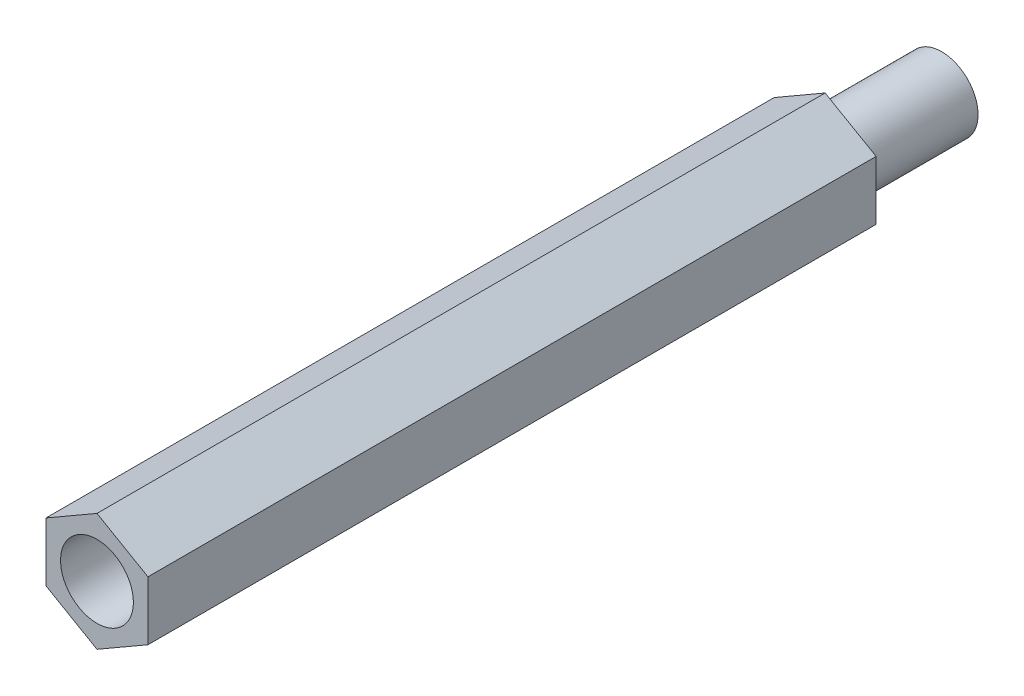
ISO-10303-21;
HEADER;
FILE_DESCRIPTION(('STEP AP214'),'2;1');
FILE_NAME('part.step','',(''),(''),'','','');
FILE_SCHEMA(('AUTOMOTIVE_DESIGN { 1 0 10303 214 1 1 1 1 }'));
ENDSEC;
DATA;
#1=APPLICATION_CONTEXT('core data for automotive mechanical design processes');
#2=APPLICATION_PROTOCOL_DEFINITION('international standard','automotive_design',2000,#1);
#3=PRODUCT_CONTEXT('',#1,'mechanical');
#4=PRODUCT('Part','Part','',(#3));
#5=PRODUCT_RELATED_PRODUCT_CATEGORY('part','',(#4));
#6=PRODUCT_DEFINITION_FORMATION('','',#4);
#7=PRODUCT_DEFINITION_CONTEXT('part definition',#1,'design');
#8=PRODUCT_DEFINITION('design','',#6,#7);
#9=PRODUCT_DEFINITION_SHAPE('','',#8);
#10=(LENGTH_UNIT() NAMED_UNIT(*) SI_UNIT(.MILLI.,.METRE.));
#11=(NAMED_UNIT(*) PLANE_ANGLE_UNIT() SI_UNIT($,.RADIAN.));
#12=(NAMED_UNIT(*) SI_UNIT($,.STERADIAN.) SOLID_ANGLE_UNIT());
#13=UNCERTAINTY_MEASURE_WITH_UNIT(LENGTH_MEASURE(1.E-05),#10,'distance_accuracy_value','');
#14=(GEOMETRIC_REPRESENTATION_CONTEXT(3) GLOBAL_UNCERTAINTY_ASSIGNED_CONTEXT((#13)) GLOBAL_UNIT_ASSIGNED_CONTEXT((#10,
#11,#12)) REPRESENTATION_CONTEXT('',''));
#15=CARTESIAN_POINT('',(0.,0.,0.));
#16=DIRECTION('',(0.,0.,1.));
#17=DIRECTION('',(1.,0.,0.));
#18=AXIS2_PLACEMENT_3D('',#15,#16,#17);
#19=CARTESIAN_POINT('',(0.,-4.04145188432738,60.));
#20=DIRECTION('',(-0.500000000000001,0.866025403784438,0.));
#21=DIRECTION('',(-0.866025403784438,-0.500000000000001,0.));
#22=AXIS2_PLACEMENT_3D('',#19,#20,#21);
#23=PLANE('',#22);
#24=DIRECTION('',(0.,0.,-1.));
#25=VECTOR('',#24,1.);
#26=CARTESIAN_POINT('',(3.5,-2.02072594216369,60.));
#27=LINE('',#26,#25);
#28=CARTESIAN_POINT('',(3.49999999999998,-2.02072594216364,50.));
#29=VERTEX_POINT('',#28);
#30=CARTESIAN_POINT('',(3.5,-2.02072594216369,0.));
#31=VERTEX_POINT('',#30);
#32=EDGE_CURVE('E42',#29,#31,#27,.T.);
#33=ORIENTED_EDGE('',*,*,#32,.F.);
#34=DIRECTION('',(0.86602540378443,0.500000000000016,0.));
#35=VECTOR('',#34,1.);
#36=CARTESIAN_POINT('',(3.49999999999998,-2.02072594216364,50.));
#37=LINE('',#36,#35);
#38=CARTESIAN_POINT('',(0.,-4.04145188432738,50.));
#39=VERTEX_POINT('',#38);
#40=EDGE_CURVE('E108',#39,#29,#37,.T.);
#41=ORIENTED_EDGE('',*,*,#40,.F.);
#42=DIRECTION('',(0.,0.,-1.));
#43=VECTOR('',#42,1.);
#44=CARTESIAN_POINT('',(0.,-4.04145188432738,60.));
#45=LINE('',#44,#43);
#46=CARTESIAN_POINT('',(0.,-4.04145188432738,0.));
#47=VERTEX_POINT('',#46);
#48=EDGE_CURVE('E55',#39,#47,#45,.T.);
#49=ORIENTED_EDGE('',*,*,#48,.T.);
#50=DIRECTION('',(0.866025403784438,0.500000000000001,0.));
#51=VECTOR('',#50,1.);
#52=CARTESIAN_POINT('',(0.,-4.04145188432738,0.));
#53=LINE('',#52,#51);
#54=EDGE_CURVE('E140',#47,#31,#53,.T.);
#55=ORIENTED_EDGE('',*,*,#54,.T.);
#56=EDGE_LOOP('',(#33,#41,#49,#55));
#57=FACE_BOUND('',#56,.T.);
#58=ADVANCED_FACE('F39',(#57),#23,.F.);
#59=CARTESIAN_POINT('',(3.5,-2.02072594216369,60.));
#60=DIRECTION('',(-1.,0.,0.));
#61=DIRECTION('',(0.,-1.,0.));
#62=AXIS2_PLACEMENT_3D('',#59,#60,#61);
#63=PLANE('',#62);
#64=DIRECTION('',(0.,0.,-1.));
#65=VECTOR('',#64,1.);
#66=CARTESIAN_POINT('',(3.5,2.02072594216369,60.));
#67=LINE('',#66,#65);
#68=CARTESIAN_POINT('',(3.49999999999998,2.02072594216373,50.));
#69=VERTEX_POINT('',#68);
#70=CARTESIAN_POINT('',(3.5,2.02072594216369,0.));
#71=VERTEX_POINT('',#70);
#72=EDGE_CURVE('E167',#69,#71,#67,.T.);
#73=ORIENTED_EDGE('',*,*,#72,.F.);
#74=DIRECTION('',(0.,1.,0.));
#75=VECTOR('',#74,1.);
#76=CARTESIAN_POINT('',(3.49999999999998,2.02072594216373,50.));
#77=LINE('',#76,#75);
#78=EDGE_CURVE('E124',#29,#69,#77,.T.);
#79=ORIENTED_EDGE('',*,*,#78,.F.);
#80=ORIENTED_EDGE('',*,*,#32,.T.);
#81=DIRECTION('',(0.,1.,0.));
#82=VECTOR('',#81,1.);
#83=CARTESIAN_POINT('',(3.5,-2.02072594216369,0.));
#84=LINE('',#83,#82);
#85=EDGE_CURVE('E144',#31,#71,#84,.T.);
#86=ORIENTED_EDGE('',*,*,#85,.T.);
#87=EDGE_LOOP('',(#73,#79,#80,#86));
#88=FACE_BOUND('',#87,.T.);
#89=ADVANCED_FACE('F175',(#88),#63,.F.);
#90=CARTESIAN_POINT('',(3.5,2.02072594216369,60.));
#91=DIRECTION('',(-0.5,-0.866025403784439,0.));
#92=DIRECTION('',(0.866025403784439,-0.5,0.));
#93=AXIS2_PLACEMENT_3D('',#90,#91,#92);
#94=PLANE('',#93);
#95=DIRECTION('',(0.,0.,-1.));
#96=VECTOR('',#95,1.);
#97=CARTESIAN_POINT('',(0.,4.04145188432738,60.));
#98=LINE('',#97,#96);
#99=CARTESIAN_POINT('',(0.,4.04145188432738,50.));
#100=VERTEX_POINT('',#99);
#101=CARTESIAN_POINT('',(0.,4.04145188432738,0.));
#102=VERTEX_POINT('',#101);
#103=EDGE_CURVE('E165',#100,#102,#98,.T.);
#104=ORIENTED_EDGE('',*,*,#103,.F.);
#105=DIRECTION('',(-0.866025403784441,0.499999999999995,0.));
#106=VECTOR('',#105,1.);
#107=CARTESIAN_POINT('',(0.,4.04145188432738,50.));
#108=LINE('',#107,#106);
#109=EDGE_CURVE('E128',#69,#100,#108,.T.);
#110=ORIENTED_EDGE('',*,*,#109,.F.);
#111=ORIENTED_EDGE('',*,*,#72,.T.);
#112=DIRECTION('',(-0.866025403784438,0.5,0.));
#113=VECTOR('',#112,1.);
#114=CARTESIAN_POINT('',(3.5,2.02072594216369,0.));
#115=LINE('',#114,#113);
#116=EDGE_CURVE('E148',#71,#102,#115,.T.);
#117=ORIENTED_EDGE('',*,*,#116,.T.);
#118=EDGE_LOOP('',(#104,#110,#111,#117));
#119=FACE_BOUND('',#118,.T.);
#120=ADVANCED_FACE('F186',(#119),#94,.F.);
#121=CARTESIAN_POINT('',(0.,4.04145188432738,60.));
#122=DIRECTION('',(0.5,-0.866025403784438,0.));
#123=DIRECTION('',(0.866025403784438,0.5,0.));
#124=AXIS2_PLACEMENT_3D('',#121,#122,#123);
#125=PLANE('',#124);
#126=DIRECTION('',(0.,0.,-1.));
#127=VECTOR('',#126,1.);
#128=CARTESIAN_POINT('',(-3.5,2.02072594216369,60.));
#129=LINE('',#128,#127);
#130=CARTESIAN_POINT('',(-3.5,2.02072594216368,50.));
#131=VERTEX_POINT('',#130);
#132=CARTESIAN_POINT('',(-3.5,2.02072594216369,0.));
#133=VERTEX_POINT('',#132);
#134=EDGE_CURVE('E100',#131,#133,#129,.T.);
#135=ORIENTED_EDGE('',*,*,#134,.F.);
#136=DIRECTION('',(-0.866025403784438,-0.500000000000001,0.));
#137=VECTOR('',#136,1.);
#138=CARTESIAN_POINT('',(-3.5,2.02072594216368,50.));
#139=LINE('',#138,#137);
#140=EDGE_CURVE('E114',#100,#131,#139,.T.);
#141=ORIENTED_EDGE('',*,*,#140,.F.);
#142=ORIENTED_EDGE('',*,*,#103,.T.);
#143=DIRECTION('',(-0.866025403784439,-0.5,0.));
#144=VECTOR('',#143,1.);
#145=CARTESIAN_POINT('',(0.,4.04145188432738,0.));
#146=LINE('',#145,#144);
#147=EDGE_CURVE('E152',#102,#133,#146,.T.);
#148=ORIENTED_EDGE('',*,*,#147,.T.);
#149=EDGE_LOOP('',(#135,#141,#142,#148));
#150=FACE_BOUND('',#149,.T.);
#151=ADVANCED_FACE('F190',(#150),#125,.F.);
#152=CARTESIAN_POINT('',(-3.5,2.02072594216369,60.));
#153=DIRECTION('',(1.,0.,0.));
#154=DIRECTION('',(0.,0.,-1.));
#155=AXIS2_PLACEMENT_3D('',#152,#153,#154);
#156=PLANE('',#155);
#157=DIRECTION('',(0.,0.,-1.));
#158=VECTOR('',#157,1.);
#159=CARTESIAN_POINT('',(-3.5,-2.02072594216369,60.));
#160=LINE('',#159,#158);
#161=CARTESIAN_POINT('',(-3.49999999999999,-2.02072594216371,50.));
#162=VERTEX_POINT('',#161);
#163=CARTESIAN_POINT('',(-3.5,-2.02072594216369,0.));
#164=VERTEX_POINT('',#163);
#165=EDGE_CURVE('E62',#162,#164,#160,.T.);
#166=ORIENTED_EDGE('',*,*,#165,.F.);
#167=DIRECTION('',(0.,-1.,0.));
#168=VECTOR('',#167,1.);
#169=CARTESIAN_POINT('',(-3.49999999999999,-2.02072594216371,50.));
#170=LINE('',#169,#168);
#171=EDGE_CURVE('E95',#131,#162,#170,.T.);
#172=ORIENTED_EDGE('',*,*,#171,.F.);
#173=ORIENTED_EDGE('',*,*,#134,.T.);
#174=DIRECTION('',(0.,-1.,0.));
#175=VECTOR('',#174,1.);
#176=CARTESIAN_POINT('',(-3.5,2.02072594216369,0.));
#177=LINE('',#176,#175);
#178=EDGE_CURVE('E97',#133,#164,#177,.T.);
#179=ORIENTED_EDGE('',*,*,#178,.T.);
#180=EDGE_LOOP('',(#166,#172,#173,#179));
#181=FACE_BOUND('',#180,.T.);
#182=ADVANCED_FACE('F93',(#181),#156,.F.);
#183=CARTESIAN_POINT('',(-3.5,-2.02072594216369,60.));
#184=DIRECTION('',(0.5,0.866025403784439,0.));
#185=DIRECTION('',(-0.866025403784439,0.5,0.));
#186=AXIS2_PLACEMENT_3D('',#183,#184,#185);
#187=PLANE('',#186);
#188=ORIENTED_EDGE('',*,*,#48,.F.);
#189=DIRECTION('',(0.866025403784441,-0.499999999999995,0.));
#190=VECTOR('',#189,1.);
#191=CARTESIAN_POINT('',(0.,-4.04145188432738,50.));
#192=LINE('',#191,#190);
#193=EDGE_CURVE('E103',#162,#39,#192,.T.);
#194=ORIENTED_EDGE('',*,*,#193,.F.);
#195=ORIENTED_EDGE('',*,*,#165,.T.);
#196=DIRECTION('',(0.866025403784438,-0.5,0.));
#197=VECTOR('',#196,1.);
#198=CARTESIAN_POINT('',(-3.5,-2.02072594216369,0.));
#199=LINE('',#198,#197);
#200=EDGE_CURVE('E158',#164,#47,#199,.T.);
#201=ORIENTED_EDGE('',*,*,#200,.T.);
#202=EDGE_LOOP('',(#188,#194,#195,#201));
#203=FACE_BOUND('',#202,.T.);
#204=ADVANCED_FACE('F104',(#203),#187,.F.);
#205=CARTESIAN_POINT('',(0.,0.,0.));
#206=DIRECTION('',(0.,0.,1.));
#207=DIRECTION('',(1.,0.,0.));
#208=AXIS2_PLACEMENT_3D('',#205,#206,#207);
#209=PLANE('',#208);
#210=CARTESIAN_POINT('',(0.,0.,0.));
#211=DIRECTION('',(0.,0.,-1.));
#212=DIRECTION('',(-1.,0.,0.));
#213=AXIS2_PLACEMENT_3D('',#210,#211,#212);
#214=CIRCLE('',#213,2.5);
#215=CARTESIAN_POINT('',(-2.5,0.,0.));
#216=VERTEX_POINT('',#215);
#217=EDGE_CURVE('E11',#216,#216,#214,.T.);
#218=ORIENTED_EDGE('',*,*,#217,.F.);
#219=EDGE_LOOP('',(#218));
#220=FACE_BOUND('',#219,.T.);
#221=ORIENTED_EDGE('',*,*,#54,.F.);
#222=ORIENTED_EDGE('',*,*,#200,.F.);
#223=ORIENTED_EDGE('',*,*,#178,.F.);
#224=ORIENTED_EDGE('',*,*,#147,.F.);
#225=ORIENTED_EDGE('',*,*,#116,.F.);
#226=ORIENTED_EDGE('',*,*,#85,.F.);
#227=EDGE_LOOP('',(#221,#222,#223,#224,#225,#226));
#228=FACE_BOUND('',#227,.T.);
#229=ADVANCED_FACE('F179',(#220,#228),#209,.F.);
#230=CARTESIAN_POINT('',(0.,0.,-8.));
#231=DIRECTION('',(0.,0.,1.));
#232=DIRECTION('',(1.,0.,0.));
#233=AXIS2_PLACEMENT_3D('',#230,#231,#232);
#234=CYLINDRICAL_SURFACE('',#233,2.5);
#235=CARTESIAN_POINT('',(0.,0.,-8.));
#236=DIRECTION('',(0.,0.,-1.));
#237=DIRECTION('',(-1.,0.,0.));
#238=AXIS2_PLACEMENT_3D('',#235,#236,#237);
#239=CIRCLE('',#238,2.5);
#240=CARTESIAN_POINT('',(-2.5,0.,-8.));
#241=VERTEX_POINT('',#240);
#242=EDGE_CURVE('E137',#241,#241,#239,.T.);
#243=ORIENTED_EDGE('',*,*,#242,.F.);
#244=EDGE_LOOP('',(#243));
#245=FACE_BOUND('',#244,.T.);
#246=ORIENTED_EDGE('',*,*,#217,.T.);
#247=EDGE_LOOP('',(#246));
#248=FACE_BOUND('',#247,.T.);
#249=ADVANCED_FACE('F202',(#245,#248),#234,.T.);
#250=CARTESIAN_POINT('',(0.,0.,-8.));
#251=DIRECTION('',(0.,0.,-1.));
#252=DIRECTION('',(-1.,0.,0.));
#253=AXIS2_PLACEMENT_3D('',#250,#251,#252);
#254=PLANE('',#253);
#255=ORIENTED_EDGE('',*,*,#242,.T.);
#256=EDGE_LOOP('',(#255));
#257=FACE_BOUND('',#256,.T.);
#258=ADVANCED_FACE('F206',(#257),#254,.T.);
#259=CARTESIAN_POINT('',(0.,0.,50.));
#260=DIRECTION('',(0.,0.,-1.));
#261=DIRECTION('',(-1.,0.,0.));
#262=AXIS2_PLACEMENT_3D('',#259,#260,#261);
#263=PLANE('',#262);
#264=CARTESIAN_POINT('',(0.,0.,50.));
#265=DIRECTION('',(0.,0.,1.));
#266=DIRECTION('',(1.,0.,0.));
#267=AXIS2_PLACEMENT_3D('',#264,#265,#266);
#268=CIRCLE('',#267,2.5);
#269=CARTESIAN_POINT('',(2.5,0.,50.));
#270=VERTEX_POINT('',#269);
#271=EDGE_CURVE('E116',#270,#270,#268,.T.);
#272=ORIENTED_EDGE('',*,*,#271,.F.);
#273=EDGE_LOOP('',(#272));
#274=FACE_BOUND('',#273,.T.);
#275=ORIENTED_EDGE('',*,*,#171,.T.);
#276=ORIENTED_EDGE('',*,*,#193,.T.);
#277=ORIENTED_EDGE('',*,*,#40,.T.);
#278=ORIENTED_EDGE('',*,*,#78,.T.);
#279=ORIENTED_EDGE('',*,*,#109,.T.);
#280=ORIENTED_EDGE('',*,*,#140,.T.);
#281=EDGE_LOOP('',(#275,#276,#277,#278,#279,#280));
#282=FACE_BOUND('',#281,.T.);
#283=ADVANCED_FACE('F111',(#274,#282),#263,.F.);
#284=CARTESIAN_POINT('',(0.,0.,10.));
#285=DIRECTION('',(0.,0.,1.));
#286=DIRECTION('',(1.,0.,0.));
#287=AXIS2_PLACEMENT_3D('',#284,#285,#286);
#288=PLANE('',#287);
#289=CARTESIAN_POINT('',(0.,0.,10.));
#290=DIRECTION('',(0.,0.,1.));
#291=DIRECTION('',(1.,0.,0.));
#292=AXIS2_PLACEMENT_3D('',#289,#290,#291);
#293=CIRCLE('',#292,2.5);
#294=CARTESIAN_POINT('',(2.5,0.,10.));
#295=VERTEX_POINT('',#294);
#296=EDGE_CURVE('E133',#295,#295,#293,.T.);
#297=ORIENTED_EDGE('',*,*,#296,.T.);
#298=EDGE_LOOP('',(#297));
#299=FACE_BOUND('',#298,.T.);
#300=ADVANCED_FACE('F214',(#299),#288,.T.);
#301=CARTESIAN_POINT('',(0.,0.,10.));
#302=DIRECTION('',(0.,0.,1.));
#303=DIRECTION('',(1.,0.,0.));
#304=AXIS2_PLACEMENT_3D('',#301,#302,#303);
#305=CYLINDRICAL_SURFACE('',#304,2.5);
#306=ORIENTED_EDGE('',*,*,#296,.F.);
#307=EDGE_LOOP('',(#306));
#308=FACE_BOUND('',#307,.T.);
#309=ORIENTED_EDGE('',*,*,#271,.T.);
#310=EDGE_LOOP('',(#309));
#311=FACE_BOUND('',#310,.T.);
#312=ADVANCED_FACE('F211',(#308,#311),#305,.F.);
#313=CLOSED_SHELL('',(#58,#89,#120,#151,#182,#204,#229,#249,#258,#283,#300,#312));
#314=MANIFOLD_SOLID_BREP('B2',#313);
#315=ADVANCED_BREP_SHAPE_REPRESENTATION('',(#18,#314),#14);
#316=SHAPE_DEFINITION_REPRESENTATION(#9,#315);
ENDSEC;
END-ISO-10303-21;
